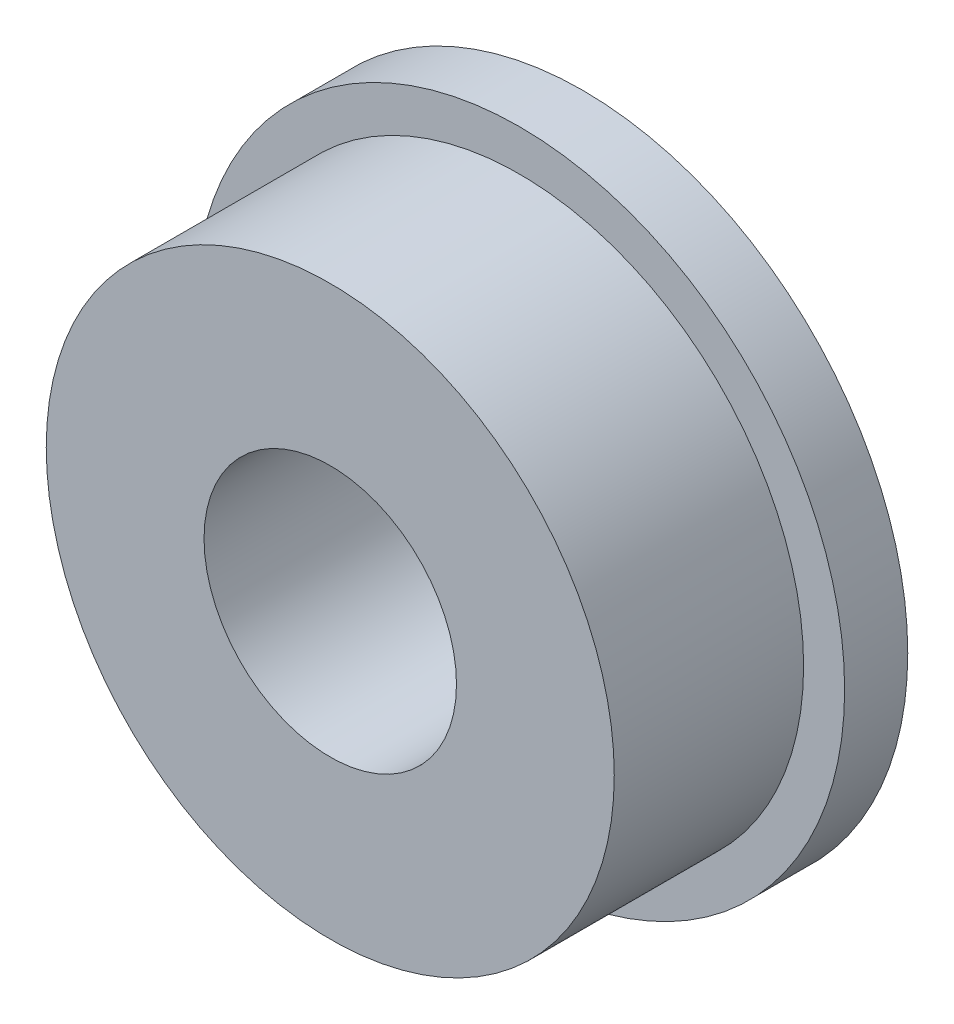
ISO-10303-21;
HEADER;
FILE_DESCRIPTION(('STEP AP214'),'2;1');
FILE_NAME('part.step','',(''),(''),'','','');
FILE_SCHEMA(('AUTOMOTIVE_DESIGN { 1 0 10303 214 1 1 1 1 }'));
ENDSEC;
DATA;
#1=APPLICATION_CONTEXT('core data for automotive mechanical design processes');
#2=APPLICATION_PROTOCOL_DEFINITION('international standard','automotive_design',2000,#1);
#3=PRODUCT_CONTEXT('',#1,'mechanical');
#4=PRODUCT('Part','Part','',(#3));
#5=PRODUCT_RELATED_PRODUCT_CATEGORY('part','',(#4));
#6=PRODUCT_DEFINITION_FORMATION('','',#4);
#7=PRODUCT_DEFINITION_CONTEXT('part definition',#1,'design');
#8=PRODUCT_DEFINITION('design','',#6,#7);
#9=PRODUCT_DEFINITION_SHAPE('','',#8);
#10=(LENGTH_UNIT() NAMED_UNIT(*) SI_UNIT(.MILLI.,.METRE.));
#11=(NAMED_UNIT(*) PLANE_ANGLE_UNIT() SI_UNIT($,.RADIAN.));
#12=(NAMED_UNIT(*) SI_UNIT($,.STERADIAN.) SOLID_ANGLE_UNIT());
#13=UNCERTAINTY_MEASURE_WITH_UNIT(LENGTH_MEASURE(1.E-05),#10,'distance_accuracy_value','');
#14=(GEOMETRIC_REPRESENTATION_CONTEXT(3) GLOBAL_UNCERTAINTY_ASSIGNED_CONTEXT((#13)) GLOBAL_UNIT_ASSIGNED_CONTEXT((#10,
#11,#12)) REPRESENTATION_CONTEXT('',''));
#15=CARTESIAN_POINT('',(0.,0.,0.));
#16=DIRECTION('',(0.,0.,1.));
#17=DIRECTION('',(1.,0.,0.));
#18=AXIS2_PLACEMENT_3D('',#15,#16,#17);
#19=CARTESIAN_POINT('',(0.,0.,4.));
#20=DIRECTION('',(0.,0.,-1.));
#21=DIRECTION('',(-1.,0.,0.));
#22=AXIS2_PLACEMENT_3D('',#19,#20,#21);
#23=CYLINDRICAL_SURFACE('',#22,4.5);
#24=CARTESIAN_POINT('',(0.,0.,4.));
#25=DIRECTION('',(0.,0.,1.));
#26=DIRECTION('',(1.,0.,0.));
#27=AXIS2_PLACEMENT_3D('',#24,#25,#26);
#28=CIRCLE('',#27,4.5);
#29=CARTESIAN_POINT('',(4.5,0.,4.));
#30=VERTEX_POINT('',#29);
#31=EDGE_CURVE('E34',#30,#30,#28,.T.);
#32=ORIENTED_EDGE('',*,*,#31,.F.);
#33=EDGE_LOOP('',(#32));
#34=FACE_BOUND('',#33,.T.);
#35=CARTESIAN_POINT('',(0.,0.,1.));
#36=DIRECTION('',(0.,0.,-1.));
#37=DIRECTION('',(-1.,0.,0.));
#38=AXIS2_PLACEMENT_3D('',#35,#36,#37);
#39=CIRCLE('',#38,4.5);
#40=CARTESIAN_POINT('',(-4.5,0.,1.));
#41=VERTEX_POINT('',#40);
#42=EDGE_CURVE('E10',#41,#41,#39,.T.);
#43=ORIENTED_EDGE('',*,*,#42,.F.);
#44=EDGE_LOOP('',(#43));
#45=FACE_BOUND('',#44,.T.);
#46=ADVANCED_FACE('F31',(#34,#45),#23,.T.);
#47=CARTESIAN_POINT('',(0.,0.,4.));
#48=DIRECTION('',(0.,0.,1.));
#49=DIRECTION('',(1.,0.,0.));
#50=AXIS2_PLACEMENT_3D('',#47,#48,#49);
#51=PLANE('',#50);
#52=ORIENTED_EDGE('',*,*,#31,.T.);
#53=EDGE_LOOP('',(#52));
#54=FACE_BOUND('',#53,.T.);
#55=CARTESIAN_POINT('',(0.,0.,4.));
#56=DIRECTION('',(0.,0.,1.));
#57=DIRECTION('',(1.,0.,0.));
#58=AXIS2_PLACEMENT_3D('',#55,#56,#57);
#59=CIRCLE('',#58,2.);
#60=CARTESIAN_POINT('',(2.,0.,4.));
#61=VERTEX_POINT('',#60);
#62=EDGE_CURVE('E42',#61,#61,#59,.T.);
#63=ORIENTED_EDGE('',*,*,#62,.F.);
#64=EDGE_LOOP('',(#63));
#65=FACE_BOUND('',#64,.T.);
#66=ADVANCED_FACE('F73',(#54,#65),#51,.T.);
#67=CARTESIAN_POINT('',(0.,0.,0.));
#68=DIRECTION('',(0.,0.,1.));
#69=DIRECTION('',(1.,0.,0.));
#70=AXIS2_PLACEMENT_3D('',#67,#68,#69);
#71=PLANE('',#70);
#72=CARTESIAN_POINT('',(0.,0.,0.));
#73=DIRECTION('',(0.,0.,1.));
#74=DIRECTION('',(1.,0.,0.));
#75=AXIS2_PLACEMENT_3D('',#72,#73,#74);
#76=CIRCLE('',#75,2.);
#77=CARTESIAN_POINT('',(2.,0.,0.));
#78=VERTEX_POINT('',#77);
#79=EDGE_CURVE('E48',#78,#78,#76,.T.);
#80=ORIENTED_EDGE('',*,*,#79,.T.);
#81=EDGE_LOOP('',(#80));
#82=FACE_BOUND('',#81,.T.);
#83=CARTESIAN_POINT('',(0.,0.,0.));
#84=DIRECTION('',(0.,0.,-1.));
#85=DIRECTION('',(-1.,0.,0.));
#86=AXIS2_PLACEMENT_3D('',#83,#84,#85);
#87=CIRCLE('',#86,5.15);
#88=CARTESIAN_POINT('',(-5.15,0.,0.));
#89=VERTEX_POINT('',#88);
#90=EDGE_CURVE('E45',#89,#89,#87,.T.);
#91=ORIENTED_EDGE('',*,*,#90,.T.);
#92=EDGE_LOOP('',(#91));
#93=FACE_BOUND('',#92,.T.);
#94=ADVANCED_FACE('F59',(#82,#93),#71,.F.);
#95=CARTESIAN_POINT('',(0.,0.,4.));
#96=DIRECTION('',(0.,0.,-1.));
#97=DIRECTION('',(-1.,0.,0.));
#98=AXIS2_PLACEMENT_3D('',#95,#96,#97);
#99=CYLINDRICAL_SURFACE('',#98,2.);
#100=ORIENTED_EDGE('',*,*,#79,.F.);
#101=EDGE_LOOP('',(#100));
#102=FACE_BOUND('',#101,.T.);
#103=ORIENTED_EDGE('',*,*,#62,.T.);
#104=EDGE_LOOP('',(#103));
#105=FACE_BOUND('',#104,.T.);
#106=ADVANCED_FACE('F68',(#102,#105),#99,.F.);
#107=CARTESIAN_POINT('',(0.,0.,1.));
#108=DIRECTION('',(0.,0.,-1.));
#109=DIRECTION('',(-1.,0.,0.));
#110=AXIS2_PLACEMENT_3D('',#107,#108,#109);
#111=PLANE('',#110);
#112=CARTESIAN_POINT('',(0.,0.,1.));
#113=DIRECTION('',(0.,0.,-1.));
#114=DIRECTION('',(-1.,0.,0.));
#115=AXIS2_PLACEMENT_3D('',#112,#113,#114);
#116=CIRCLE('',#115,5.15);
#117=CARTESIAN_POINT('',(-5.15,0.,1.));
#118=VERTEX_POINT('',#117);
#119=EDGE_CURVE('E50',#118,#118,#116,.T.);
#120=ORIENTED_EDGE('',*,*,#119,.F.);
#121=EDGE_LOOP('',(#120));
#122=FACE_BOUND('',#121,.T.);
#123=ORIENTED_EDGE('',*,*,#42,.T.);
#124=EDGE_LOOP('',(#123));
#125=FACE_BOUND('',#124,.T.);
#126=ADVANCED_FACE('F63',(#122,#125),#111,.F.);
#127=CARTESIAN_POINT('',(0.,0.,1.));
#128=DIRECTION('',(0.,0.,-1.));
#129=DIRECTION('',(-1.,0.,0.));
#130=AXIS2_PLACEMENT_3D('',#127,#128,#129);
#131=CYLINDRICAL_SURFACE('',#130,5.15);
#132=ORIENTED_EDGE('',*,*,#119,.T.);
#133=EDGE_LOOP('',(#132));
#134=FACE_BOUND('',#133,.T.);
#135=ORIENTED_EDGE('',*,*,#90,.F.);
#136=EDGE_LOOP('',(#135));
#137=FACE_BOUND('',#136,.T.);
#138=ADVANCED_FACE('F61',(#134,#137),#131,.T.);
#139=CLOSED_SHELL('',(#46,#66,#94,#106,#126,#138));
#140=MANIFOLD_SOLID_BREP('B2',#139);
#141=ADVANCED_BREP_SHAPE_REPRESENTATION('',(#18,#140),#14);
#142=SHAPE_DEFINITION_REPRESENTATION(#9,#141);
ENDSEC;
END-ISO-10303-21;
